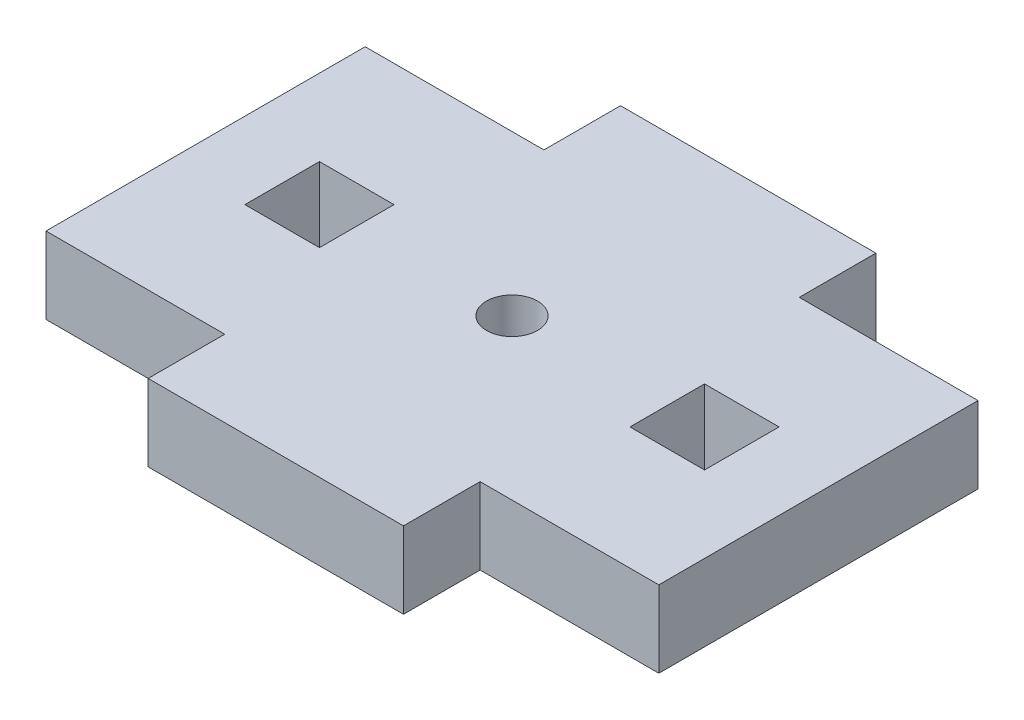
ISO-10303-21;
HEADER;
FILE_DESCRIPTION(('STEP AP214'),'2;1');
FILE_NAME('part.step','',(''),(''),'','','');
FILE_SCHEMA(('AUTOMOTIVE_DESIGN { 1 0 10303 214 1 1 1 1 }'));
ENDSEC;
DATA;
#1=APPLICATION_CONTEXT('core data for automotive mechanical design processes');
#2=APPLICATION_PROTOCOL_DEFINITION('international standard','automotive_design',2000,#1);
#3=PRODUCT_CONTEXT('',#1,'mechanical');
#4=PRODUCT('Part','Part','',(#3));
#5=PRODUCT_RELATED_PRODUCT_CATEGORY('part','',(#4));
#6=PRODUCT_DEFINITION_FORMATION('','',#4);
#7=PRODUCT_DEFINITION_CONTEXT('part definition',#1,'design');
#8=PRODUCT_DEFINITION('design','',#6,#7);
#9=PRODUCT_DEFINITION_SHAPE('','',#8);
#10=(LENGTH_UNIT() NAMED_UNIT(*) SI_UNIT(.MILLI.,.METRE.));
#11=(NAMED_UNIT(*) PLANE_ANGLE_UNIT() SI_UNIT($,.RADIAN.));
#12=(NAMED_UNIT(*) SI_UNIT($,.STERADIAN.) SOLID_ANGLE_UNIT());
#13=UNCERTAINTY_MEASURE_WITH_UNIT(LENGTH_MEASURE(1.E-05),#10,'distance_accuracy_value','');
#14=(GEOMETRIC_REPRESENTATION_CONTEXT(3) GLOBAL_UNCERTAINTY_ASSIGNED_CONTEXT((#13)) GLOBAL_UNIT_ASSIGNED_CONTEXT((#10,
#11,#12)) REPRESENTATION_CONTEXT('',''));
#15=CARTESIAN_POINT('',(0.,0.,0.));
#16=DIRECTION('',(0.,0.,1.));
#17=DIRECTION('',(1.,0.,0.));
#18=AXIS2_PLACEMENT_3D('',#15,#16,#17);
#19=CARTESIAN_POINT('',(3.98099009900989,3.,0.));
#20=DIRECTION('',(1.,0.,0.));
#21=DIRECTION('',(0.,0.,-1.));
#22=AXIS2_PLACEMENT_3D('',#19,#20,#21);
#23=PLANE('',#22);
#24=DIRECTION('',(0.,0.,1.));
#25=VECTOR('',#24,1.);
#26=CARTESIAN_POINT('',(3.98099009900989,0.,0.));
#27=LINE('',#26,#25);
#28=CARTESIAN_POINT('',(3.98099009900989,0.,-0.3520260629024));
#29=VERTEX_POINT('',#28);
#30=CARTESIAN_POINT('',(3.98099009900989,0.,2.5679739370976));
#31=VERTEX_POINT('',#30);
#32=EDGE_CURVE('E295',#29,#31,#27,.T.);
#33=ORIENTED_EDGE('',*,*,#32,.F.);
#34=DIRECTION('',(0.,-1.,0.));
#35=VECTOR('',#34,1.);
#36=CARTESIAN_POINT('',(3.98099009900989,3.,-0.3520260629024));
#37=LINE('',#36,#35);
#38=CARTESIAN_POINT('',(3.98099009900989,3.,-0.3520260629024));
#39=VERTEX_POINT('',#38);
#40=EDGE_CURVE('E11',#39,#29,#37,.T.);
#41=ORIENTED_EDGE('',*,*,#40,.F.);
#42=DIRECTION('',(0.,0.,1.));
#43=VECTOR('',#42,1.);
#44=CARTESIAN_POINT('',(3.98099009900989,3.,0.));
#45=LINE('',#44,#43);
#46=CARTESIAN_POINT('',(3.98099009900989,3.,2.5679739370976));
#47=VERTEX_POINT('',#46);
#48=EDGE_CURVE('E193',#39,#47,#45,.T.);
#49=ORIENTED_EDGE('',*,*,#48,.T.);
#50=DIRECTION('',(0.,-1.,0.));
#51=VECTOR('',#50,1.);
#52=CARTESIAN_POINT('',(3.98099009900989,3.,2.5679739370976));
#53=LINE('',#52,#51);
#54=EDGE_CURVE('E54',#47,#31,#53,.T.);
#55=ORIENTED_EDGE('',*,*,#54,.T.);
#56=EDGE_LOOP('',(#33,#41,#49,#55));
#57=FACE_BOUND('',#56,.T.);
#58=ADVANCED_FACE('F35',(#57),#23,.T.);
#59=CARTESIAN_POINT('',(0.,3.,-0.3520260629024));
#60=DIRECTION('',(0.,0.,-1.));
#61=DIRECTION('',(-1.,0.,0.));
#62=AXIS2_PLACEMENT_3D('',#59,#60,#61);
#63=PLANE('',#62);
#64=DIRECTION('',(1.,0.,0.));
#65=VECTOR('',#64,1.);
#66=CARTESIAN_POINT('',(0.,0.,-0.3520260629024));
#67=LINE('',#66,#65);
#68=CARTESIAN_POINT('',(6.90099009900989,0.,-0.3520260629024));
#69=VERTEX_POINT('',#68);
#70=EDGE_CURVE('E198',#29,#69,#67,.T.);
#71=ORIENTED_EDGE('',*,*,#70,.T.);
#72=DIRECTION('',(0.,-1.,0.));
#73=VECTOR('',#72,1.);
#74=CARTESIAN_POINT('',(6.90099009900989,3.,-0.3520260629024));
#75=LINE('',#74,#73);
#76=CARTESIAN_POINT('',(6.90099009900989,3.,-0.3520260629024));
#77=VERTEX_POINT('',#76);
#78=EDGE_CURVE('E45',#77,#69,#75,.T.);
#79=ORIENTED_EDGE('',*,*,#78,.F.);
#80=DIRECTION('',(1.,0.,0.));
#81=VECTOR('',#80,1.);
#82=CARTESIAN_POINT('',(0.,3.,-0.3520260629024));
#83=LINE('',#82,#81);
#84=EDGE_CURVE('E187',#39,#77,#83,.T.);
#85=ORIENTED_EDGE('',*,*,#84,.F.);
#86=ORIENTED_EDGE('',*,*,#40,.T.);
#87=EDGE_LOOP('',(#71,#79,#85,#86));
#88=FACE_BOUND('',#87,.T.);
#89=ADVANCED_FACE('F196',(#88),#63,.F.);
#90=CARTESIAN_POINT('',(6.90099009900989,3.,0.));
#91=DIRECTION('',(1.,0.,0.));
#92=DIRECTION('',(0.,0.,-1.));
#93=AXIS2_PLACEMENT_3D('',#90,#91,#92);
#94=PLANE('',#93);
#95=DIRECTION('',(0.,0.,1.));
#96=VECTOR('',#95,1.);
#97=CARTESIAN_POINT('',(6.90099009900989,0.,0.));
#98=LINE('',#97,#96);
#99=CARTESIAN_POINT('',(6.90099009900989,0.,2.5679739370976));
#100=VERTEX_POINT('',#99);
#101=EDGE_CURVE('E298',#69,#100,#98,.T.);
#102=ORIENTED_EDGE('',*,*,#101,.T.);
#103=DIRECTION('',(0.,-1.,0.));
#104=VECTOR('',#103,1.);
#105=CARTESIAN_POINT('',(6.90099009900989,3.,2.5679739370976));
#106=LINE('',#105,#104);
#107=CARTESIAN_POINT('',(6.90099009900989,3.,2.5679739370976));
#108=VERTEX_POINT('',#107);
#109=EDGE_CURVE('E116',#108,#100,#106,.T.);
#110=ORIENTED_EDGE('',*,*,#109,.F.);
#111=DIRECTION('',(0.,0.,1.));
#112=VECTOR('',#111,1.);
#113=CARTESIAN_POINT('',(6.90099009900989,3.,0.));
#114=LINE('',#113,#112);
#115=EDGE_CURVE('E179',#77,#108,#114,.T.);
#116=ORIENTED_EDGE('',*,*,#115,.F.);
#117=ORIENTED_EDGE('',*,*,#78,.T.);
#118=EDGE_LOOP('',(#102,#110,#116,#117));
#119=FACE_BOUND('',#118,.T.);
#120=ADVANCED_FACE('F181',(#119),#94,.F.);
#121=CARTESIAN_POINT('',(9.90099009900989,3.,0.));
#122=DIRECTION('',(1.,0.,0.));
#123=DIRECTION('',(0.,0.,-1.));
#124=AXIS2_PLACEMENT_3D('',#121,#122,#123);
#125=PLANE('',#124);
#126=DIRECTION('',(0.,0.,1.));
#127=VECTOR('',#126,1.);
#128=CARTESIAN_POINT('',(9.90099009900989,0.,0.));
#129=LINE('',#128,#127);
#130=CARTESIAN_POINT('',(9.90099009900989,0.,-5.1420260629024));
#131=VERTEX_POINT('',#130);
#132=CARTESIAN_POINT('',(9.90099009900989,0.,7.3579739370976));
#133=VERTEX_POINT('',#132);
#134=EDGE_CURVE('E263',#131,#133,#129,.T.);
#135=ORIENTED_EDGE('',*,*,#134,.F.);
#136=DIRECTION('',(0.,-1.,0.));
#137=VECTOR('',#136,1.);
#138=CARTESIAN_POINT('',(9.90099009900989,3.,-5.1420260629024));
#139=LINE('',#138,#137);
#140=CARTESIAN_POINT('',(9.90099009900989,3.,-5.1420260629024));
#141=VERTEX_POINT('',#140);
#142=EDGE_CURVE('E228',#141,#131,#139,.T.);
#143=ORIENTED_EDGE('',*,*,#142,.F.);
#144=DIRECTION('',(0.,0.,1.));
#145=VECTOR('',#144,1.);
#146=CARTESIAN_POINT('',(9.90099009900989,3.,0.));
#147=LINE('',#146,#145);
#148=CARTESIAN_POINT('',(9.90099009900989,3.,7.3579739370976));
#149=VERTEX_POINT('',#148);
#150=EDGE_CURVE('E317',#141,#149,#147,.T.);
#151=ORIENTED_EDGE('',*,*,#150,.T.);
#152=DIRECTION('',(0.,-1.,0.));
#153=VECTOR('',#152,1.);
#154=CARTESIAN_POINT('',(9.90099009900989,3.,7.3579739370976));
#155=LINE('',#154,#153);
#156=EDGE_CURVE('E203',#149,#133,#155,.T.);
#157=ORIENTED_EDGE('',*,*,#156,.T.);
#158=EDGE_LOOP('',(#135,#143,#151,#157));
#159=FACE_BOUND('',#158,.T.);
#160=ADVANCED_FACE('F410',(#159),#125,.T.);
#161=CARTESIAN_POINT('',(0.,3.,-5.1420260629024));
#162=DIRECTION('',(0.,0.,-1.));
#163=DIRECTION('',(-1.,0.,0.));
#164=AXIS2_PLACEMENT_3D('',#161,#162,#163);
#165=PLANE('',#164);
#166=DIRECTION('',(1.,0.,0.));
#167=VECTOR('',#166,1.);
#168=CARTESIAN_POINT('',(0.,0.,-5.1420260629024));
#169=LINE('',#168,#167);
#170=CARTESIAN_POINT('',(2.90099009900989,0.,-5.1420260629024));
#171=VERTEX_POINT('',#170);
#172=EDGE_CURVE('E266',#171,#131,#169,.T.);
#173=ORIENTED_EDGE('',*,*,#172,.F.);
#174=DIRECTION('',(0.,-1.,0.));
#175=VECTOR('',#174,1.);
#176=CARTESIAN_POINT('',(2.90099009900989,3.,-5.1420260629024));
#177=LINE('',#176,#175);
#178=CARTESIAN_POINT('',(2.90099009900989,3.,-5.1420260629024));
#179=VERTEX_POINT('',#178);
#180=EDGE_CURVE('E226',#179,#171,#177,.T.);
#181=ORIENTED_EDGE('',*,*,#180,.F.);
#182=DIRECTION('',(1.,0.,0.));
#183=VECTOR('',#182,1.);
#184=CARTESIAN_POINT('',(0.,3.,-5.1420260629024));
#185=LINE('',#184,#183);
#186=EDGE_CURVE('E320',#179,#141,#185,.T.);
#187=ORIENTED_EDGE('',*,*,#186,.T.);
#188=ORIENTED_EDGE('',*,*,#142,.T.);
#189=EDGE_LOOP('',(#173,#181,#187,#188));
#190=FACE_BOUND('',#189,.T.);
#191=ADVANCED_FACE('F398',(#190),#165,.T.);
#192=CARTESIAN_POINT('',(2.90099009900989,3.,0.));
#193=DIRECTION('',(-1.,0.,0.));
#194=DIRECTION('',(0.,0.,1.));
#195=AXIS2_PLACEMENT_3D('',#192,#193,#194);
#196=PLANE('',#195);
#197=DIRECTION('',(0.,0.,-1.));
#198=VECTOR('',#197,1.);
#199=CARTESIAN_POINT('',(2.90099009900989,0.,0.));
#200=LINE('',#199,#198);
#201=CARTESIAN_POINT('',(2.90099009900989,0.,-8.1420260629024));
#202=VERTEX_POINT('',#201);
#203=EDGE_CURVE('E269',#171,#202,#200,.T.);
#204=ORIENTED_EDGE('',*,*,#203,.T.);
#205=DIRECTION('',(0.,-1.,0.));
#206=VECTOR('',#205,1.);
#207=CARTESIAN_POINT('',(2.90099009900989,3.,-8.1420260629024));
#208=LINE('',#207,#206);
#209=CARTESIAN_POINT('',(2.90099009900989,3.,-8.1420260629024));
#210=VERTEX_POINT('',#209);
#211=EDGE_CURVE('E223',#210,#202,#208,.T.);
#212=ORIENTED_EDGE('',*,*,#211,.F.);
#213=DIRECTION('',(0.,0.,-1.));
#214=VECTOR('',#213,1.);
#215=CARTESIAN_POINT('',(2.90099009900989,3.,0.));
#216=LINE('',#215,#214);
#217=EDGE_CURVE('E323',#179,#210,#216,.T.);
#218=ORIENTED_EDGE('',*,*,#217,.F.);
#219=ORIENTED_EDGE('',*,*,#180,.T.);
#220=EDGE_LOOP('',(#204,#212,#218,#219));
#221=FACE_BOUND('',#220,.T.);
#222=ADVANCED_FACE('F405',(#221),#196,.F.);
#223=CARTESIAN_POINT('',(0.,3.,-8.1420260629024));
#224=DIRECTION('',(0.,0.,1.));
#225=DIRECTION('',(1.,0.,0.));
#226=AXIS2_PLACEMENT_3D('',#223,#224,#225);
#227=PLANE('',#226);
#228=DIRECTION('',(-1.,0.,0.));
#229=VECTOR('',#228,1.);
#230=CARTESIAN_POINT('',(0.,0.,-8.1420260629024));
#231=LINE('',#230,#229);
#232=CARTESIAN_POINT('',(-7.09900990099011,0.,-8.1420260629024));
#233=VERTEX_POINT('',#232);
#234=EDGE_CURVE('E273',#202,#233,#231,.T.);
#235=ORIENTED_EDGE('',*,*,#234,.T.);
#236=DIRECTION('',(0.,-1.,0.));
#237=VECTOR('',#236,1.);
#238=CARTESIAN_POINT('',(-7.09900990099011,3.,-8.1420260629024));
#239=LINE('',#238,#237);
#240=CARTESIAN_POINT('',(-7.09900990099011,3.,-8.1420260629024));
#241=VERTEX_POINT('',#240);
#242=EDGE_CURVE('E220',#241,#233,#239,.T.);
#243=ORIENTED_EDGE('',*,*,#242,.F.);
#244=DIRECTION('',(-1.,0.,0.));
#245=VECTOR('',#244,1.);
#246=CARTESIAN_POINT('',(0.,3.,-8.1420260629024));
#247=LINE('',#246,#245);
#248=EDGE_CURVE('E327',#210,#241,#247,.T.);
#249=ORIENTED_EDGE('',*,*,#248,.F.);
#250=ORIENTED_EDGE('',*,*,#211,.T.);
#251=EDGE_LOOP('',(#235,#243,#249,#250));
#252=FACE_BOUND('',#251,.T.);
#253=ADVANCED_FACE('F401',(#252),#227,.F.);
#254=CARTESIAN_POINT('',(-7.09900990099011,3.,0.));
#255=DIRECTION('',(1.,0.,0.));
#256=DIRECTION('',(0.,0.,-1.));
#257=AXIS2_PLACEMENT_3D('',#254,#255,#256);
#258=PLANE('',#257);
#259=DIRECTION('',(0.,0.,1.));
#260=VECTOR('',#259,1.);
#261=CARTESIAN_POINT('',(-7.09900990099011,0.,0.));
#262=LINE('',#261,#260);
#263=CARTESIAN_POINT('',(-7.09900990099011,0.,-5.1420260629024));
#264=VERTEX_POINT('',#263);
#265=EDGE_CURVE('E276',#233,#264,#262,.T.);
#266=ORIENTED_EDGE('',*,*,#265,.T.);
#267=DIRECTION('',(0.,-1.,0.));
#268=VECTOR('',#267,1.);
#269=CARTESIAN_POINT('',(-7.09900990099011,3.,-5.1420260629024));
#270=LINE('',#269,#268);
#271=CARTESIAN_POINT('',(-7.09900990099011,3.,-5.1420260629024));
#272=VERTEX_POINT('',#271);
#273=EDGE_CURVE('E218',#272,#264,#270,.T.);
#274=ORIENTED_EDGE('',*,*,#273,.F.);
#275=DIRECTION('',(0.,0.,1.));
#276=VECTOR('',#275,1.);
#277=CARTESIAN_POINT('',(-7.09900990099011,3.,0.));
#278=LINE('',#277,#276);
#279=EDGE_CURVE('E330',#241,#272,#278,.T.);
#280=ORIENTED_EDGE('',*,*,#279,.F.);
#281=ORIENTED_EDGE('',*,*,#242,.T.);
#282=EDGE_LOOP('',(#266,#274,#280,#281));
#283=FACE_BOUND('',#282,.T.);
#284=ADVANCED_FACE('F396',(#283),#258,.F.);
#285=CARTESIAN_POINT('',(-14.0990099009901,0.,-5.1420260629024));
#286=VERTEX_POINT('',#285);
#287=EDGE_CURVE('E270',#286,#264,#169,.T.);
#288=ORIENTED_EDGE('',*,*,#287,.F.);
#289=DIRECTION('',(0.,-1.,0.));
#290=VECTOR('',#289,1.);
#291=CARTESIAN_POINT('',(-14.0990099009901,3.,-5.1420260629024));
#292=LINE('',#291,#290);
#293=CARTESIAN_POINT('',(-14.0990099009901,3.,-5.1420260629024));
#294=VERTEX_POINT('',#293);
#295=EDGE_CURVE('E216',#294,#286,#292,.T.);
#296=ORIENTED_EDGE('',*,*,#295,.F.);
#297=EDGE_CURVE('E324',#294,#272,#185,.T.);
#298=ORIENTED_EDGE('',*,*,#297,.T.);
#299=ORIENTED_EDGE('',*,*,#273,.T.);
#300=EDGE_LOOP('',(#288,#296,#298,#299));
#301=FACE_BOUND('',#300,.T.);
#302=ADVANCED_FACE('F392',(#301),#165,.T.);
#303=CARTESIAN_POINT('',(-14.0990099009901,3.,0.));
#304=DIRECTION('',(1.,0.,0.));
#305=DIRECTION('',(0.,0.,-1.));
#306=AXIS2_PLACEMENT_3D('',#303,#304,#305);
#307=PLANE('',#306);
#308=DIRECTION('',(0.,0.,1.));
#309=VECTOR('',#308,1.);
#310=CARTESIAN_POINT('',(-14.0990099009901,0.,0.));
#311=LINE('',#310,#309);
#312=CARTESIAN_POINT('',(-14.0990099009901,0.,7.3579739370976));
#313=VERTEX_POINT('',#312);
#314=EDGE_CURVE('E279',#286,#313,#311,.T.);
#315=ORIENTED_EDGE('',*,*,#314,.T.);
#316=DIRECTION('',(0.,-1.,0.));
#317=VECTOR('',#316,1.);
#318=CARTESIAN_POINT('',(-14.0990099009901,3.,7.3579739370976));
#319=LINE('',#318,#317);
#320=CARTESIAN_POINT('',(-14.0990099009901,3.,7.3579739370976));
#321=VERTEX_POINT('',#320);
#322=EDGE_CURVE('E213',#321,#313,#319,.T.);
#323=ORIENTED_EDGE('',*,*,#322,.F.);
#324=DIRECTION('',(0.,0.,1.));
#325=VECTOR('',#324,1.);
#326=CARTESIAN_POINT('',(-14.0990099009901,3.,0.));
#327=LINE('',#326,#325);
#328=EDGE_CURVE('E332',#294,#321,#327,.T.);
#329=ORIENTED_EDGE('',*,*,#328,.F.);
#330=ORIENTED_EDGE('',*,*,#295,.T.);
#331=EDGE_LOOP('',(#315,#323,#329,#330));
#332=FACE_BOUND('',#331,.T.);
#333=ADVANCED_FACE('F389',(#332),#307,.F.);
#334=CARTESIAN_POINT('',(0.,3.,7.3579739370976));
#335=DIRECTION('',(0.,0.,-1.));
#336=DIRECTION('',(-1.,0.,0.));
#337=AXIS2_PLACEMENT_3D('',#334,#335,#336);
#338=PLANE('',#337);
#339=DIRECTION('',(1.,0.,0.));
#340=VECTOR('',#339,1.);
#341=CARTESIAN_POINT('',(0.,0.,7.3579739370976));
#342=LINE('',#341,#340);
#343=CARTESIAN_POINT('',(-7.09900990099011,0.,7.3579739370976));
#344=VERTEX_POINT('',#343);
#345=EDGE_CURVE('E282',#313,#344,#342,.T.);
#346=ORIENTED_EDGE('',*,*,#345,.T.);
#347=DIRECTION('',(0.,-1.,0.));
#348=VECTOR('',#347,1.);
#349=CARTESIAN_POINT('',(-7.09900990099011,3.,7.3579739370976));
#350=LINE('',#349,#348);
#351=CARTESIAN_POINT('',(-7.09900990099011,3.,7.3579739370976));
#352=VERTEX_POINT('',#351);
#353=EDGE_CURVE('E211',#352,#344,#350,.T.);
#354=ORIENTED_EDGE('',*,*,#353,.F.);
#355=DIRECTION('',(1.,0.,0.));
#356=VECTOR('',#355,1.);
#357=CARTESIAN_POINT('',(0.,3.,7.3579739370976));
#358=LINE('',#357,#356);
#359=EDGE_CURVE('E335',#321,#352,#358,.T.);
#360=ORIENTED_EDGE('',*,*,#359,.F.);
#361=ORIENTED_EDGE('',*,*,#322,.T.);
#362=EDGE_LOOP('',(#346,#354,#360,#361));
#363=FACE_BOUND('',#362,.T.);
#364=ADVANCED_FACE('F376',(#363),#338,.F.);
#365=CARTESIAN_POINT('',(-7.09900990099011,3.,0.));
#366=DIRECTION('',(-1.,0.,0.));
#367=DIRECTION('',(0.,0.,1.));
#368=AXIS2_PLACEMENT_3D('',#365,#366,#367);
#369=PLANE('',#368);
#370=DIRECTION('',(0.,0.,-1.));
#371=VECTOR('',#370,1.);
#372=CARTESIAN_POINT('',(-7.09900990099011,0.,0.));
#373=LINE('',#372,#371);
#374=CARTESIAN_POINT('',(-7.09900990099011,0.,10.3579739370976));
#375=VERTEX_POINT('',#374);
#376=EDGE_CURVE('E285',#375,#344,#373,.T.);
#377=ORIENTED_EDGE('',*,*,#376,.F.);
#378=DIRECTION('',(0.,-1.,0.));
#379=VECTOR('',#378,1.);
#380=CARTESIAN_POINT('',(-7.09900990099011,3.,10.3579739370976));
#381=LINE('',#380,#379);
#382=CARTESIAN_POINT('',(-7.09900990099011,3.,10.3579739370976));
#383=VERTEX_POINT('',#382);
#384=EDGE_CURVE('E209',#383,#375,#381,.T.);
#385=ORIENTED_EDGE('',*,*,#384,.F.);
#386=DIRECTION('',(0.,0.,-1.));
#387=VECTOR('',#386,1.);
#388=CARTESIAN_POINT('',(-7.09900990099011,3.,0.));
#389=LINE('',#388,#387);
#390=EDGE_CURVE('E337',#383,#352,#389,.T.);
#391=ORIENTED_EDGE('',*,*,#390,.T.);
#392=ORIENTED_EDGE('',*,*,#353,.T.);
#393=EDGE_LOOP('',(#377,#385,#391,#392));
#394=FACE_BOUND('',#393,.T.);
#395=ADVANCED_FACE('F384',(#394),#369,.T.);
#396=CARTESIAN_POINT('',(0.,3.,10.3579739370976));
#397=DIRECTION('',(0.,0.,1.));
#398=DIRECTION('',(1.,0.,0.));
#399=AXIS2_PLACEMENT_3D('',#396,#397,#398);
#400=PLANE('',#399);
#401=DIRECTION('',(-1.,0.,0.));
#402=VECTOR('',#401,1.);
#403=CARTESIAN_POINT('',(0.,0.,10.3579739370976));
#404=LINE('',#403,#402);
#405=CARTESIAN_POINT('',(2.90099009900989,0.,10.3579739370976));
#406=VERTEX_POINT('',#405);
#407=EDGE_CURVE('E289',#406,#375,#404,.T.);
#408=ORIENTED_EDGE('',*,*,#407,.F.);
#409=DIRECTION('',(0.,-1.,0.));
#410=VECTOR('',#409,1.);
#411=CARTESIAN_POINT('',(2.90099009900989,3.,10.3579739370976));
#412=LINE('',#411,#410);
#413=CARTESIAN_POINT('',(2.90099009900989,3.,10.3579739370976));
#414=VERTEX_POINT('',#413);
#415=EDGE_CURVE('E207',#414,#406,#412,.T.);
#416=ORIENTED_EDGE('',*,*,#415,.F.);
#417=DIRECTION('',(-1.,0.,0.));
#418=VECTOR('',#417,1.);
#419=CARTESIAN_POINT('',(0.,3.,10.3579739370976));
#420=LINE('',#419,#418);
#421=EDGE_CURVE('E341',#414,#383,#420,.T.);
#422=ORIENTED_EDGE('',*,*,#421,.T.);
#423=ORIENTED_EDGE('',*,*,#384,.T.);
#424=EDGE_LOOP('',(#408,#416,#422,#423));
#425=FACE_BOUND('',#424,.T.);
#426=ADVANCED_FACE('F380',(#425),#400,.T.);
#427=CARTESIAN_POINT('',(2.90099009900989,3.,0.));
#428=DIRECTION('',(1.,0.,0.));
#429=DIRECTION('',(0.,0.,-1.));
#430=AXIS2_PLACEMENT_3D('',#427,#428,#429);
#431=PLANE('',#430);
#432=DIRECTION('',(0.,0.,1.));
#433=VECTOR('',#432,1.);
#434=CARTESIAN_POINT('',(2.90099009900989,0.,0.));
#435=LINE('',#434,#433);
#436=CARTESIAN_POINT('',(2.90099009900989,0.,7.3579739370976));
#437=VERTEX_POINT('',#436);
#438=EDGE_CURVE('E292',#437,#406,#435,.T.);
#439=ORIENTED_EDGE('',*,*,#438,.F.);
#440=DIRECTION('',(0.,-1.,0.));
#441=VECTOR('',#440,1.);
#442=CARTESIAN_POINT('',(2.90099009900989,3.,7.3579739370976));
#443=LINE('',#442,#441);
#444=CARTESIAN_POINT('',(2.90099009900989,3.,7.3579739370976));
#445=VERTEX_POINT('',#444);
#446=EDGE_CURVE('E205',#445,#437,#443,.T.);
#447=ORIENTED_EDGE('',*,*,#446,.F.);
#448=DIRECTION('',(0.,0.,1.));
#449=VECTOR('',#448,1.);
#450=CARTESIAN_POINT('',(2.90099009900989,3.,0.));
#451=LINE('',#450,#449);
#452=EDGE_CURVE('E344',#445,#414,#451,.T.);
#453=ORIENTED_EDGE('',*,*,#452,.T.);
#454=ORIENTED_EDGE('',*,*,#415,.T.);
#455=EDGE_LOOP('',(#439,#447,#453,#454));
#456=FACE_BOUND('',#455,.T.);
#457=ADVANCED_FACE('F377',(#456),#431,.T.);
#458=CARTESIAN_POINT('',(-11.0990099009901,3.,0.));
#459=DIRECTION('',(1.,0.,0.));
#460=DIRECTION('',(0.,0.,-1.));
#461=AXIS2_PLACEMENT_3D('',#458,#459,#460);
#462=PLANE('',#461);
#463=DIRECTION('',(0.,0.,1.));
#464=VECTOR('',#463,1.);
#465=CARTESIAN_POINT('',(-11.0990099009901,0.,0.));
#466=LINE('',#465,#464);
#467=CARTESIAN_POINT('',(-11.0990099009901,0.,-0.352026062902401));
#468=VERTEX_POINT('',#467);
#469=CARTESIAN_POINT('',(-11.0990099009901,0.,2.5679739370976));
#470=VERTEX_POINT('',#469);
#471=EDGE_CURVE('E252',#468,#470,#466,.T.);
#472=ORIENTED_EDGE('',*,*,#471,.F.);
#473=DIRECTION('',(0.,-1.,0.));
#474=VECTOR('',#473,1.);
#475=CARTESIAN_POINT('',(-11.0990099009901,3.,-0.352026062902401));
#476=LINE('',#475,#474);
#477=CARTESIAN_POINT('',(-11.0990099009901,3.,-0.352026062902401));
#478=VERTEX_POINT('',#477);
#479=EDGE_CURVE('E39',#478,#468,#476,.T.);
#480=ORIENTED_EDGE('',*,*,#479,.F.);
#481=DIRECTION('',(0.,0.,1.));
#482=VECTOR('',#481,1.);
#483=CARTESIAN_POINT('',(-11.0990099009901,3.,0.));
#484=LINE('',#483,#482);
#485=CARTESIAN_POINT('',(-11.0990099009901,3.,2.5679739370976));
#486=VERTEX_POINT('',#485);
#487=EDGE_CURVE('E305',#478,#486,#484,.T.);
#488=ORIENTED_EDGE('',*,*,#487,.T.);
#489=DIRECTION('',(0.,-1.,0.));
#490=VECTOR('',#489,1.);
#491=CARTESIAN_POINT('',(-11.0990099009901,3.,2.5679739370976));
#492=LINE('',#491,#490);
#493=EDGE_CURVE('E230',#486,#470,#492,.T.);
#494=ORIENTED_EDGE('',*,*,#493,.T.);
#495=EDGE_LOOP('',(#472,#480,#488,#494));
#496=FACE_BOUND('',#495,.T.);
#497=ADVANCED_FACE('F37',(#496),#462,.T.);
#498=CARTESIAN_POINT('',(0.,3.,-0.352026062902401));
#499=DIRECTION('',(0.,0.,-1.));
#500=DIRECTION('',(-1.,0.,0.));
#501=AXIS2_PLACEMENT_3D('',#498,#499,#500);
#502=PLANE('',#501);
#503=DIRECTION('',(1.,0.,0.));
#504=VECTOR('',#503,1.);
#505=CARTESIAN_POINT('',(0.,0.,-0.352026062902401));
#506=LINE('',#505,#504);
#507=CARTESIAN_POINT('',(-8.17900990099011,0.,-0.352026062902401));
#508=VERTEX_POINT('',#507);
#509=EDGE_CURVE('E244',#468,#508,#506,.T.);
#510=ORIENTED_EDGE('',*,*,#509,.T.);
#511=DIRECTION('',(0.,-1.,0.));
#512=VECTOR('',#511,1.);
#513=CARTESIAN_POINT('',(-8.17900990099011,3.,-0.352026062902401));
#514=LINE('',#513,#512);
#515=CARTESIAN_POINT('',(-8.17900990099011,3.,-0.352026062902401));
#516=VERTEX_POINT('',#515);
#517=EDGE_CURVE('E234',#516,#508,#514,.T.);
#518=ORIENTED_EDGE('',*,*,#517,.F.);
#519=DIRECTION('',(1.,0.,0.));
#520=VECTOR('',#519,1.);
#521=CARTESIAN_POINT('',(0.,3.,-0.352026062902401));
#522=LINE('',#521,#520);
#523=EDGE_CURVE('E245',#478,#516,#522,.T.);
#524=ORIENTED_EDGE('',*,*,#523,.F.);
#525=ORIENTED_EDGE('',*,*,#479,.T.);
#526=EDGE_LOOP('',(#510,#518,#524,#525));
#527=FACE_BOUND('',#526,.T.);
#528=ADVANCED_FACE('F243',(#527),#502,.F.);
#529=CARTESIAN_POINT('',(-8.17900990099011,3.,0.));
#530=DIRECTION('',(1.,0.,0.));
#531=DIRECTION('',(0.,0.,-1.));
#532=AXIS2_PLACEMENT_3D('',#529,#530,#531);
#533=PLANE('',#532);
#534=DIRECTION('',(0.,0.,1.));
#535=VECTOR('',#534,1.);
#536=CARTESIAN_POINT('',(-8.17900990099011,0.,0.));
#537=LINE('',#536,#535);
#538=CARTESIAN_POINT('',(-8.17900990099011,0.,2.5679739370976));
#539=VERTEX_POINT('',#538);
#540=EDGE_CURVE('E254',#508,#539,#537,.T.);
#541=ORIENTED_EDGE('',*,*,#540,.T.);
#542=DIRECTION('',(0.,-1.,0.));
#543=VECTOR('',#542,1.);
#544=CARTESIAN_POINT('',(-8.17900990099011,3.,2.5679739370976));
#545=LINE('',#544,#543);
#546=CARTESIAN_POINT('',(-8.17900990099011,3.,2.5679739370976));
#547=VERTEX_POINT('',#546);
#548=EDGE_CURVE('E232',#547,#539,#545,.T.);
#549=ORIENTED_EDGE('',*,*,#548,.F.);
#550=DIRECTION('',(0.,0.,1.));
#551=VECTOR('',#550,1.);
#552=CARTESIAN_POINT('',(-8.17900990099011,3.,0.));
#553=LINE('',#552,#551);
#554=EDGE_CURVE('E310',#516,#547,#553,.T.);
#555=ORIENTED_EDGE('',*,*,#554,.F.);
#556=ORIENTED_EDGE('',*,*,#517,.T.);
#557=EDGE_LOOP('',(#541,#549,#555,#556));
#558=FACE_BOUND('',#557,.T.);
#559=ADVANCED_FACE('F417',(#558),#533,.F.);
#560=CARTESIAN_POINT('',(0.,3.,2.5679739370976));
#561=DIRECTION('',(0.,0.,-1.));
#562=DIRECTION('',(-1.,0.,0.));
#563=AXIS2_PLACEMENT_3D('',#560,#561,#562);
#564=PLANE('',#563);
#565=DIRECTION('',(1.,0.,0.));
#566=VECTOR('',#565,1.);
#567=CARTESIAN_POINT('',(0.,0.,2.5679739370976));
#568=LINE('',#567,#566);
#569=EDGE_CURVE('E300',#31,#100,#568,.T.);
#570=ORIENTED_EDGE('',*,*,#569,.F.);
#571=ORIENTED_EDGE('',*,*,#54,.F.);
#572=DIRECTION('',(1.,0.,0.));
#573=VECTOR('',#572,1.);
#574=CARTESIAN_POINT('',(0.,3.,2.5679739370976));
#575=LINE('',#574,#573);
#576=EDGE_CURVE('E186',#47,#108,#575,.T.);
#577=ORIENTED_EDGE('',*,*,#576,.T.);
#578=ORIENTED_EDGE('',*,*,#109,.T.);
#579=EDGE_LOOP('',(#570,#571,#577,#578));
#580=FACE_BOUND('',#579,.T.);
#581=ADVANCED_FACE('F374',(#580),#564,.T.);
#582=EDGE_CURVE('E286',#437,#133,#342,.T.);
#583=ORIENTED_EDGE('',*,*,#582,.T.);
#584=ORIENTED_EDGE('',*,*,#156,.F.);
#585=EDGE_CURVE('E338',#445,#149,#358,.T.);
#586=ORIENTED_EDGE('',*,*,#585,.F.);
#587=ORIENTED_EDGE('',*,*,#446,.T.);
#588=EDGE_LOOP('',(#583,#584,#586,#587));
#589=FACE_BOUND('',#588,.T.);
#590=ADVANCED_FACE('F371',(#589),#338,.F.);
#591=CARTESIAN_POINT('',(0.,3.,2.5679739370976));
#592=DIRECTION('',(0.,0.,-1.));
#593=DIRECTION('',(-1.,0.,0.));
#594=AXIS2_PLACEMENT_3D('',#591,#592,#593);
#595=PLANE('',#594);
#596=DIRECTION('',(1.,0.,0.));
#597=VECTOR('',#596,1.);
#598=CARTESIAN_POINT('',(0.,0.,2.5679739370976));
#599=LINE('',#598,#597);
#600=EDGE_CURVE('E261',#470,#539,#599,.T.);
#601=ORIENTED_EDGE('',*,*,#600,.F.);
#602=ORIENTED_EDGE('',*,*,#493,.F.);
#603=DIRECTION('',(1.,0.,0.));
#604=VECTOR('',#603,1.);
#605=CARTESIAN_POINT('',(0.,3.,2.5679739370976));
#606=LINE('',#605,#604);
#607=EDGE_CURVE('E314',#486,#547,#606,.T.);
#608=ORIENTED_EDGE('',*,*,#607,.T.);
#609=ORIENTED_EDGE('',*,*,#548,.T.);
#610=EDGE_LOOP('',(#601,#602,#608,#609));
#611=FACE_BOUND('',#610,.T.);
#612=ADVANCED_FACE('F360',(#611),#595,.T.);
#613=CARTESIAN_POINT('',(-2.09900990099011,3.,1.1079739370976));
#614=DIRECTION('',(0.,-1.,0.));
#615=DIRECTION('',(0.,0.,-1.));
#616=AXIS2_PLACEMENT_3D('',#613,#614,#615);
#617=CYLINDRICAL_SURFACE('',#616,1.);
#618=CARTESIAN_POINT('',(-2.09900990099011,3.,1.1079739370976));
#619=DIRECTION('',(0.,1.,0.));
#620=DIRECTION('',(0.,0.,1.));
#621=AXIS2_PLACEMENT_3D('',#618,#619,#620);
#622=CIRCLE('',#621,1.);
#623=CARTESIAN_POINT('',(-2.09900990099011,3.,2.1079739370976));
#624=VERTEX_POINT('',#623);
#625=EDGE_CURVE('E233',#624,#624,#622,.T.);
#626=ORIENTED_EDGE('',*,*,#625,.T.);
#627=EDGE_LOOP('',(#626));
#628=FACE_BOUND('',#627,.T.);
#629=CARTESIAN_POINT('',(-2.09900990099011,0.,1.1079739370976));
#630=DIRECTION('',(0.,1.,0.));
#631=DIRECTION('',(0.,0.,1.));
#632=AXIS2_PLACEMENT_3D('',#629,#630,#631);
#633=CIRCLE('',#632,1.);
#634=CARTESIAN_POINT('',(-2.09900990099011,0.,2.1079739370976));
#635=VERTEX_POINT('',#634);
#636=EDGE_CURVE('E303',#635,#635,#633,.T.);
#637=ORIENTED_EDGE('',*,*,#636,.F.);
#638=EDGE_LOOP('',(#637));
#639=FACE_BOUND('',#638,.T.);
#640=ADVANCED_FACE('F350',(#628,#639),#617,.F.);
#641=CARTESIAN_POINT('',(0.,3.,0.));
#642=DIRECTION('',(0.,1.,0.));
#643=DIRECTION('',(0.,0.,1.));
#644=AXIS2_PLACEMENT_3D('',#641,#642,#643);
#645=PLANE('',#644);
#646=ORIENTED_EDGE('',*,*,#487,.F.);
#647=ORIENTED_EDGE('',*,*,#523,.T.);
#648=ORIENTED_EDGE('',*,*,#554,.T.);
#649=ORIENTED_EDGE('',*,*,#607,.F.);
#650=EDGE_LOOP('',(#646,#647,#648,#649));
#651=FACE_BOUND('',#650,.T.);
#652=ORIENTED_EDGE('',*,*,#150,.F.);
#653=ORIENTED_EDGE('',*,*,#186,.F.);
#654=ORIENTED_EDGE('',*,*,#217,.T.);
#655=ORIENTED_EDGE('',*,*,#248,.T.);
#656=ORIENTED_EDGE('',*,*,#279,.T.);
#657=ORIENTED_EDGE('',*,*,#297,.F.);
#658=ORIENTED_EDGE('',*,*,#328,.T.);
#659=ORIENTED_EDGE('',*,*,#359,.T.);
#660=ORIENTED_EDGE('',*,*,#390,.F.);
#661=ORIENTED_EDGE('',*,*,#421,.F.);
#662=ORIENTED_EDGE('',*,*,#452,.F.);
#663=ORIENTED_EDGE('',*,*,#585,.T.);
#664=EDGE_LOOP('',(#652,#653,#654,#655,#656,#657,#658,#659,#660,#661,#662,#663));
#665=FACE_BOUND('',#664,.T.);
#666=ORIENTED_EDGE('',*,*,#48,.F.);
#667=ORIENTED_EDGE('',*,*,#84,.T.);
#668=ORIENTED_EDGE('',*,*,#115,.T.);
#669=ORIENTED_EDGE('',*,*,#576,.F.);
#670=EDGE_LOOP('',(#666,#667,#668,#669));
#671=FACE_BOUND('',#670,.T.);
#672=ORIENTED_EDGE('',*,*,#625,.F.);
#673=EDGE_LOOP('',(#672));
#674=FACE_BOUND('',#673,.T.);
#675=ADVANCED_FACE('F191',(#651,#665,#671,#674),#645,.T.);
#676=CARTESIAN_POINT('',(0.,0.,0.));
#677=DIRECTION('',(0.,1.,0.));
#678=DIRECTION('',(0.,0.,1.));
#679=AXIS2_PLACEMENT_3D('',#676,#677,#678);
#680=PLANE('',#679);
#681=ORIENTED_EDGE('',*,*,#471,.T.);
#682=ORIENTED_EDGE('',*,*,#600,.T.);
#683=ORIENTED_EDGE('',*,*,#540,.F.);
#684=ORIENTED_EDGE('',*,*,#509,.F.);
#685=EDGE_LOOP('',(#681,#682,#683,#684));
#686=FACE_BOUND('',#685,.T.);
#687=ORIENTED_EDGE('',*,*,#134,.T.);
#688=ORIENTED_EDGE('',*,*,#582,.F.);
#689=ORIENTED_EDGE('',*,*,#438,.T.);
#690=ORIENTED_EDGE('',*,*,#407,.T.);
#691=ORIENTED_EDGE('',*,*,#376,.T.);
#692=ORIENTED_EDGE('',*,*,#345,.F.);
#693=ORIENTED_EDGE('',*,*,#314,.F.);
#694=ORIENTED_EDGE('',*,*,#287,.T.);
#695=ORIENTED_EDGE('',*,*,#265,.F.);
#696=ORIENTED_EDGE('',*,*,#234,.F.);
#697=ORIENTED_EDGE('',*,*,#203,.F.);
#698=ORIENTED_EDGE('',*,*,#172,.T.);
#699=EDGE_LOOP('',(#687,#688,#689,#690,#691,#692,#693,#694,#695,#696,#697,#698));
#700=FACE_BOUND('',#699,.T.);
#701=ORIENTED_EDGE('',*,*,#32,.T.);
#702=ORIENTED_EDGE('',*,*,#569,.T.);
#703=ORIENTED_EDGE('',*,*,#101,.F.);
#704=ORIENTED_EDGE('',*,*,#70,.F.);
#705=EDGE_LOOP('',(#701,#702,#703,#704));
#706=FACE_BOUND('',#705,.T.);
#707=ORIENTED_EDGE('',*,*,#636,.T.);
#708=EDGE_LOOP('',(#707));
#709=FACE_BOUND('',#708,.T.);
#710=ADVANCED_FACE('F249',(#686,#700,#706,#709),#680,.F.);
#711=CLOSED_SHELL('',(#58,#89,#120,#160,#191,#222,#253,#284,#302,#333,#364,#395,#426,#457,#497,
#528,#559,#581,#590,#612,#640,#675,#710));
#712=MANIFOLD_SOLID_BREP('B2',#711);
#713=ADVANCED_BREP_SHAPE_REPRESENTATION('',(#18,#712),#14);
#714=SHAPE_DEFINITION_REPRESENTATION(#9,#713);
ENDSEC;
END-ISO-10303-21;
